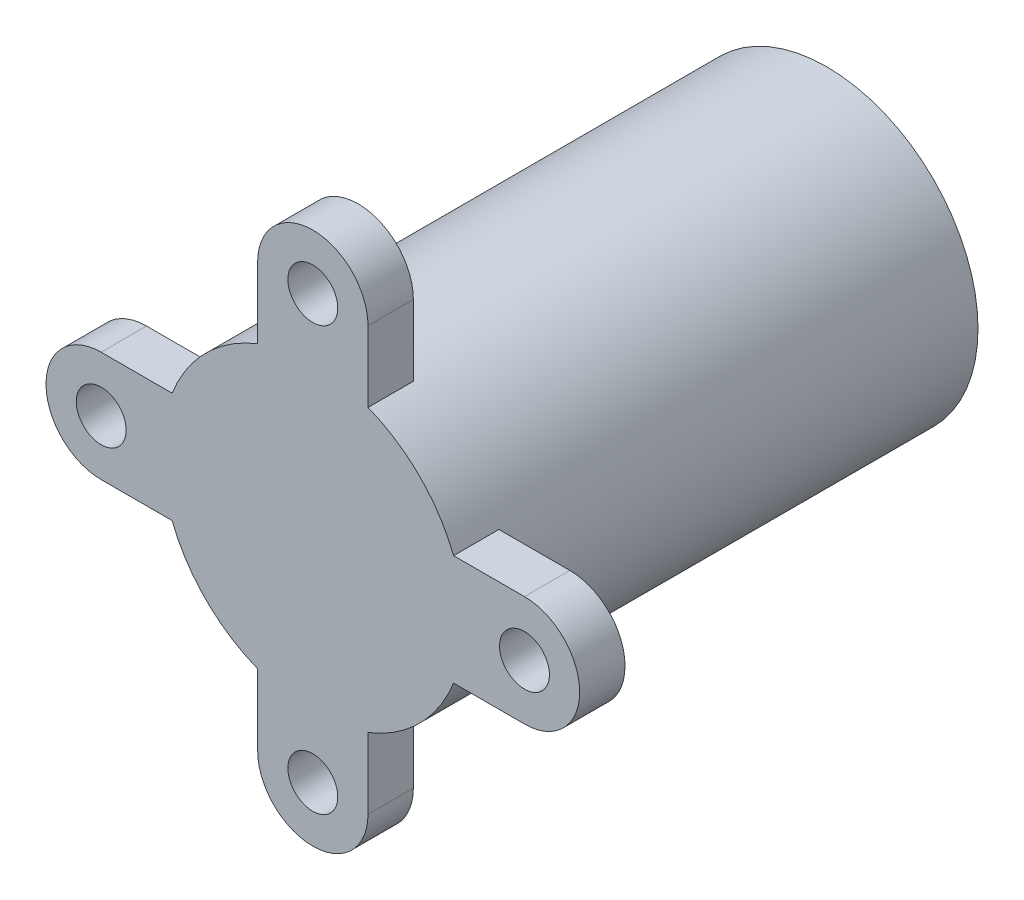
ISO-10303-21;
HEADER;
FILE_DESCRIPTION(('STEP AP214'),'2;1');
FILE_NAME('part.step','',(''),(''),'','','');
FILE_SCHEMA(('AUTOMOTIVE_DESIGN { 1 0 10303 214 1 1 1 1 }'));
ENDSEC;
DATA;
#1=APPLICATION_CONTEXT('core data for automotive mechanical design processes');
#2=APPLICATION_PROTOCOL_DEFINITION('international standard','automotive_design',2000,#1);
#3=PRODUCT_CONTEXT('',#1,'mechanical');
#4=PRODUCT('Part','Part','',(#3));
#5=PRODUCT_RELATED_PRODUCT_CATEGORY('part','',(#4));
#6=PRODUCT_DEFINITION_FORMATION('','',#4);
#7=PRODUCT_DEFINITION_CONTEXT('part definition',#1,'design');
#8=PRODUCT_DEFINITION('design','',#6,#7);
#9=PRODUCT_DEFINITION_SHAPE('','',#8);
#10=(LENGTH_UNIT() NAMED_UNIT(*) SI_UNIT(.MILLI.,.METRE.));
#11=(NAMED_UNIT(*) PLANE_ANGLE_UNIT() SI_UNIT($,.RADIAN.));
#12=(NAMED_UNIT(*) SI_UNIT($,.STERADIAN.) SOLID_ANGLE_UNIT());
#13=UNCERTAINTY_MEASURE_WITH_UNIT(LENGTH_MEASURE(1.E-05),#10,'distance_accuracy_value','');
#14=(GEOMETRIC_REPRESENTATION_CONTEXT(3) GLOBAL_UNCERTAINTY_ASSIGNED_CONTEXT((#13)) GLOBAL_UNIT_ASSIGNED_CONTEXT((#10,
#11,#12)) REPRESENTATION_CONTEXT('',''));
#15=CARTESIAN_POINT('',(0.,0.,0.));
#16=DIRECTION('',(0.,0.,1.));
#17=DIRECTION('',(1.,0.,0.));
#18=AXIS2_PLACEMENT_3D('',#15,#16,#17);
#19=CARTESIAN_POINT('',(0.,0.,0.));
#20=DIRECTION('',(0.,0.,1.));
#21=DIRECTION('',(1.,0.,0.));
#22=AXIS2_PLACEMENT_3D('',#19,#20,#21);
#23=PLANE('',#22);
#24=CARTESIAN_POINT('',(0.,0.,0.));
#25=DIRECTION('',(0.,0.,-1.));
#26=DIRECTION('',(1.,0.,0.));
#27=AXIS2_PLACEMENT_3D('',#24,#25,#26);
#28=CIRCLE('',#27,4.25);
#29=CARTESIAN_POINT('',(-4.25,0.,0.));
#30=VERTEX_POINT('',#29);
#31=EDGE_CURVE('E425',#30,#30,#28,.T.);
#32=ORIENTED_EDGE('',*,*,#31,.T.);
#33=EDGE_LOOP('',(#32));
#34=FACE_BOUND('',#33,.T.);
#35=ADVANCED_FACE('F16',(#34),#23,.F.);
#36=CARTESIAN_POINT('',(0.,0.,20.));
#37=DIRECTION('',(0.,0.,1.));
#38=DIRECTION('',(1.,0.,0.));
#39=AXIS2_PLACEMENT_3D('',#36,#37,#38);
#40=PLANE('',#39);
#41=CARTESIAN_POINT('',(14.,0.,20.));
#42=DIRECTION('',(0.,0.,-1.));
#43=DIRECTION('',(-1.,0.,0.));
#44=AXIS2_PLACEMENT_3D('',#41,#42,#43);
#45=CIRCLE('',#44,1.65);
#46=CARTESIAN_POINT('',(15.65,0.,20.));
#47=VERTEX_POINT('',#46);
#48=EDGE_CURVE('E415',#47,#47,#45,.T.);
#49=ORIENTED_EDGE('',*,*,#48,.T.);
#50=EDGE_LOOP('',(#49));
#51=FACE_BOUND('',#50,.T.);
#52=CARTESIAN_POINT('',(0.,14.,20.));
#53=DIRECTION('',(0.,0.,-1.));
#54=DIRECTION('',(0.,-1.,0.));
#55=AXIS2_PLACEMENT_3D('',#52,#53,#54);
#56=CIRCLE('',#55,1.65);
#57=CARTESIAN_POINT('',(0.,15.65,20.));
#58=VERTEX_POINT('',#57);
#59=EDGE_CURVE('E373',#58,#58,#56,.T.);
#60=ORIENTED_EDGE('',*,*,#59,.T.);
#61=EDGE_LOOP('',(#60));
#62=FACE_BOUND('',#61,.T.);
#63=CARTESIAN_POINT('',(-14.,0.,20.));
#64=DIRECTION('',(0.,0.,-1.));
#65=DIRECTION('',(1.,0.,0.));
#66=AXIS2_PLACEMENT_3D('',#63,#64,#65);
#67=CIRCLE('',#66,1.65);
#68=CARTESIAN_POINT('',(-15.65,0.,20.));
#69=VERTEX_POINT('',#68);
#70=EDGE_CURVE('E387',#69,#69,#67,.T.);
#71=ORIENTED_EDGE('',*,*,#70,.T.);
#72=EDGE_LOOP('',(#71));
#73=FACE_BOUND('',#72,.T.);
#74=CARTESIAN_POINT('',(0.,-14.,20.));
#75=DIRECTION('',(0.,0.,-1.));
#76=DIRECTION('',(0.,1.,0.));
#77=AXIS2_PLACEMENT_3D('',#74,#75,#76);
#78=CIRCLE('',#77,1.65);
#79=CARTESIAN_POINT('',(0.,-15.65,20.));
#80=VERTEX_POINT('',#79);
#81=EDGE_CURVE('E442',#80,#80,#78,.T.);
#82=ORIENTED_EDGE('',*,*,#81,.T.);
#83=EDGE_LOOP('',(#82));
#84=FACE_BOUND('',#83,.T.);
#85=CARTESIAN_POINT('',(0.,0.,20.));
#86=DIRECTION('',(0.,0.,1.));
#87=DIRECTION('',(1.,0.,0.));
#88=AXIS2_PLACEMENT_3D('',#85,#86,#87);
#89=CIRCLE('',#88,10.);
#90=CARTESIAN_POINT('',(9.31007518766632,3.65,20.));
#91=VERTEX_POINT('',#90);
#92=CARTESIAN_POINT('',(3.65,9.31007518766632,20.));
#93=VERTEX_POINT('',#92);
#94=EDGE_CURVE('E27',#91,#93,#89,.T.);
#95=ORIENTED_EDGE('',*,*,#94,.T.);
#96=DIRECTION('',(0.,-1.,0.));
#97=VECTOR('',#96,1.);
#98=CARTESIAN_POINT('',(3.65,14.,20.));
#99=LINE('',#98,#97);
#100=CARTESIAN_POINT('',(3.65,14.,20.));
#101=VERTEX_POINT('',#100);
#102=EDGE_CURVE('E488',#101,#93,#99,.T.);
#103=ORIENTED_EDGE('',*,*,#102,.F.);
#104=CARTESIAN_POINT('',(0.,14.,20.));
#105=DIRECTION('',(0.,0.,1.));
#106=DIRECTION('',(0.,1.,0.));
#107=AXIS2_PLACEMENT_3D('',#104,#105,#106);
#108=CIRCLE('',#107,3.65);
#109=CARTESIAN_POINT('',(-3.65,14.,20.));
#110=VERTEX_POINT('',#109);
#111=EDGE_CURVE('E396',#101,#110,#108,.T.);
#112=ORIENTED_EDGE('',*,*,#111,.T.);
#113=DIRECTION('',(0.,-1.,0.));
#114=VECTOR('',#113,1.);
#115=CARTESIAN_POINT('',(-3.65,14.,20.));
#116=LINE('',#115,#114);
#117=CARTESIAN_POINT('',(-3.65,9.31007518766632,20.));
#118=VERTEX_POINT('',#117);
#119=EDGE_CURVE('E350',#110,#118,#116,.T.);
#120=ORIENTED_EDGE('',*,*,#119,.T.);
#121=CARTESIAN_POINT('',(0.,0.,20.));
#122=DIRECTION('',(0.,0.,1.));
#123=DIRECTION('',(1.,0.,0.));
#124=AXIS2_PLACEMENT_3D('',#121,#122,#123);
#125=CIRCLE('',#124,10.);
#126=CARTESIAN_POINT('',(-9.31007518766632,3.65,20.));
#127=VERTEX_POINT('',#126);
#128=EDGE_CURVE('E330',#118,#127,#125,.T.);
#129=ORIENTED_EDGE('',*,*,#128,.T.);
#130=DIRECTION('',(1.,0.,0.));
#131=VECTOR('',#130,1.);
#132=CARTESIAN_POINT('',(-14.,3.65,20.));
#133=LINE('',#132,#131);
#134=CARTESIAN_POINT('',(-14.,3.65,20.));
#135=VERTEX_POINT('',#134);
#136=EDGE_CURVE('E540',#135,#127,#133,.T.);
#137=ORIENTED_EDGE('',*,*,#136,.F.);
#138=CARTESIAN_POINT('',(-14.,0.,20.));
#139=DIRECTION('',(0.,0.,1.));
#140=DIRECTION('',(-1.,0.,0.));
#141=AXIS2_PLACEMENT_3D('',#138,#139,#140);
#142=CIRCLE('',#141,3.65);
#143=CARTESIAN_POINT('',(-14.,-3.65,20.));
#144=VERTEX_POINT('',#143);
#145=EDGE_CURVE('E192',#135,#144,#142,.T.);
#146=ORIENTED_EDGE('',*,*,#145,.T.);
#147=DIRECTION('',(1.,0.,0.));
#148=VECTOR('',#147,1.);
#149=CARTESIAN_POINT('',(-14.,-3.65,20.));
#150=LINE('',#149,#148);
#151=CARTESIAN_POINT('',(-9.31007518766632,-3.65,20.));
#152=VERTEX_POINT('',#151);
#153=EDGE_CURVE('E383',#144,#152,#150,.T.);
#154=ORIENTED_EDGE('',*,*,#153,.T.);
#155=CARTESIAN_POINT('',(0.,0.,20.));
#156=DIRECTION('',(0.,0.,1.));
#157=DIRECTION('',(1.,0.,0.));
#158=AXIS2_PLACEMENT_3D('',#155,#156,#157);
#159=CIRCLE('',#158,10.);
#160=CARTESIAN_POINT('',(-3.65,-9.31007518766632,20.));
#161=VERTEX_POINT('',#160);
#162=EDGE_CURVE('E176',#152,#161,#159,.T.);
#163=ORIENTED_EDGE('',*,*,#162,.T.);
#164=DIRECTION('',(0.,1.,0.));
#165=VECTOR('',#164,1.);
#166=CARTESIAN_POINT('',(-3.65,-14.,20.));
#167=LINE('',#166,#165);
#168=CARTESIAN_POINT('',(-3.65,-14.,20.));
#169=VERTEX_POINT('',#168);
#170=EDGE_CURVE('E363',#169,#161,#167,.T.);
#171=ORIENTED_EDGE('',*,*,#170,.F.);
#172=CARTESIAN_POINT('',(0.,-14.,20.));
#173=DIRECTION('',(0.,0.,1.));
#174=DIRECTION('',(0.,-1.,0.));
#175=AXIS2_PLACEMENT_3D('',#172,#173,#174);
#176=CIRCLE('',#175,3.65);
#177=CARTESIAN_POINT('',(3.65,-14.,20.));
#178=VERTEX_POINT('',#177);
#179=EDGE_CURVE('E392',#169,#178,#176,.T.);
#180=ORIENTED_EDGE('',*,*,#179,.T.);
#181=DIRECTION('',(0.,1.,0.));
#182=VECTOR('',#181,1.);
#183=CARTESIAN_POINT('',(3.65,-14.,20.));
#184=LINE('',#183,#182);
#185=CARTESIAN_POINT('',(3.65,-9.31007518766632,20.));
#186=VERTEX_POINT('',#185);
#187=EDGE_CURVE('E431',#178,#186,#184,.T.);
#188=ORIENTED_EDGE('',*,*,#187,.T.);
#189=CARTESIAN_POINT('',(0.,0.,20.));
#190=DIRECTION('',(0.,0.,1.));
#191=DIRECTION('',(1.,0.,0.));
#192=AXIS2_PLACEMENT_3D('',#189,#190,#191);
#193=CIRCLE('',#192,10.);
#194=CARTESIAN_POINT('',(9.31007518766632,-3.65,20.));
#195=VERTEX_POINT('',#194);
#196=EDGE_CURVE('E11',#186,#195,#193,.T.);
#197=ORIENTED_EDGE('',*,*,#196,.T.);
#198=DIRECTION('',(-1.,0.,0.));
#199=VECTOR('',#198,1.);
#200=CARTESIAN_POINT('',(14.,-3.65,20.));
#201=LINE('',#200,#199);
#202=CARTESIAN_POINT('',(14.,-3.65,20.));
#203=VERTEX_POINT('',#202);
#204=EDGE_CURVE('E546',#203,#195,#201,.T.);
#205=ORIENTED_EDGE('',*,*,#204,.F.);
#206=CARTESIAN_POINT('',(14.,0.,20.));
#207=DIRECTION('',(0.,0.,1.));
#208=DIRECTION('',(1.,0.,0.));
#209=AXIS2_PLACEMENT_3D('',#206,#207,#208);
#210=CIRCLE('',#209,3.65);
#211=CARTESIAN_POINT('',(14.,3.65,20.));
#212=VERTEX_POINT('',#211);
#213=EDGE_CURVE('E569',#203,#212,#210,.T.);
#214=ORIENTED_EDGE('',*,*,#213,.T.);
#215=DIRECTION('',(-1.,0.,0.));
#216=VECTOR('',#215,1.);
#217=CARTESIAN_POINT('',(14.,3.65,20.));
#218=LINE('',#217,#216);
#219=EDGE_CURVE('E417',#212,#91,#218,.T.);
#220=ORIENTED_EDGE('',*,*,#219,.T.);
#221=EDGE_LOOP('',(#95,#103,#112,#120,#129,#137,#146,#154,#163,#171,#180,#188,#197,#205,#214,#220));
#222=FACE_BOUND('',#221,.T.);
#223=ADVANCED_FACE('F18',(#51,#62,#73,#84,#222),#40,.T.);
#224=CARTESIAN_POINT('',(0.,0.,0.));
#225=DIRECTION('',(0.,0.,1.));
#226=DIRECTION('',(1.,0.,0.));
#227=AXIS2_PLACEMENT_3D('',#224,#225,#226);
#228=CYLINDRICAL_SURFACE('',#227,10.);
#229=DIRECTION('',(0.,0.,1.));
#230=VECTOR('',#229,1.);
#231=CARTESIAN_POINT('',(-3.65,-9.31007518766632,0.));
#232=LINE('',#231,#230);
#233=CARTESIAN_POINT('',(-3.65,-9.31007518766632,17.));
#234=VERTEX_POINT('',#233);
#235=EDGE_CURVE('E367',#234,#161,#232,.T.);
#236=ORIENTED_EDGE('',*,*,#235,.T.);
#237=ORIENTED_EDGE('',*,*,#162,.F.);
#238=DIRECTION('',(0.,0.,-1.));
#239=VECTOR('',#238,1.);
#240=CARTESIAN_POINT('',(-9.31007518766632,-3.65,0.));
#241=LINE('',#240,#239);
#242=CARTESIAN_POINT('',(-9.31007518766632,-3.65,17.));
#243=VERTEX_POINT('',#242);
#244=EDGE_CURVE('E453',#152,#243,#241,.T.);
#245=ORIENTED_EDGE('',*,*,#244,.T.);
#246=CARTESIAN_POINT('',(0.,0.,17.));
#247=DIRECTION('',(0.,0.,-1.));
#248=DIRECTION('',(1.,0.,0.));
#249=AXIS2_PLACEMENT_3D('',#246,#247,#248);
#250=CIRCLE('',#249,10.);
#251=CARTESIAN_POINT('',(-10.,0.,17.));
#252=VERTEX_POINT('',#251);
#253=EDGE_CURVE('E299',#243,#252,#250,.T.);
#254=ORIENTED_EDGE('',*,*,#253,.T.);
#255=DIRECTION('',(0.,0.,-1.));
#256=VECTOR('',#255,1.);
#257=CARTESIAN_POINT('',(-10.,0.,0.));
#258=LINE('',#257,#256);
#259=CARTESIAN_POINT('',(-10.,0.,-14.));
#260=VERTEX_POINT('',#259);
#261=EDGE_CURVE('E325',#252,#260,#258,.T.);
#262=ORIENTED_EDGE('',*,*,#261,.T.);
#263=CARTESIAN_POINT('',(0.,0.,-14.));
#264=DIRECTION('',(0.,0.,-1.));
#265=DIRECTION('',(1.,0.,0.));
#266=AXIS2_PLACEMENT_3D('',#263,#264,#265);
#267=CIRCLE('',#266,10.);
#268=EDGE_CURVE('E328',#260,#260,#267,.T.);
#269=ORIENTED_EDGE('',*,*,#268,.F.);
#270=ORIENTED_EDGE('',*,*,#261,.F.);
#271=CARTESIAN_POINT('',(0.,0.,17.));
#272=DIRECTION('',(0.,0.,-1.));
#273=DIRECTION('',(1.,0.,0.));
#274=AXIS2_PLACEMENT_3D('',#271,#272,#273);
#275=CIRCLE('',#274,10.);
#276=CARTESIAN_POINT('',(-9.31007518766632,3.65,17.));
#277=VERTEX_POINT('',#276);
#278=EDGE_CURVE('E405',#252,#277,#275,.T.);
#279=ORIENTED_EDGE('',*,*,#278,.T.);
#280=DIRECTION('',(0.,0.,1.));
#281=VECTOR('',#280,1.);
#282=CARTESIAN_POINT('',(-9.31007518766632,3.65,0.));
#283=LINE('',#282,#281);
#284=EDGE_CURVE('E402',#277,#127,#283,.T.);
#285=ORIENTED_EDGE('',*,*,#284,.T.);
#286=ORIENTED_EDGE('',*,*,#128,.F.);
#287=DIRECTION('',(0.,0.,-1.));
#288=VECTOR('',#287,1.);
#289=CARTESIAN_POINT('',(-3.65,9.31007518766632,0.));
#290=LINE('',#289,#288);
#291=CARTESIAN_POINT('',(-3.65,9.31007518766632,17.));
#292=VERTEX_POINT('',#291);
#293=EDGE_CURVE('E356',#118,#292,#290,.T.);
#294=ORIENTED_EDGE('',*,*,#293,.T.);
#295=CARTESIAN_POINT('',(0.,0.,17.));
#296=DIRECTION('',(0.,0.,-1.));
#297=DIRECTION('',(1.,0.,0.));
#298=AXIS2_PLACEMENT_3D('',#295,#296,#297);
#299=CIRCLE('',#298,10.);
#300=CARTESIAN_POINT('',(3.65,9.31007518766632,17.));
#301=VERTEX_POINT('',#300);
#302=EDGE_CURVE('E358',#292,#301,#299,.T.);
#303=ORIENTED_EDGE('',*,*,#302,.T.);
#304=DIRECTION('',(0.,0.,1.));
#305=VECTOR('',#304,1.);
#306=CARTESIAN_POINT('',(3.65,9.31007518766632,0.));
#307=LINE('',#306,#305);
#308=EDGE_CURVE('E526',#301,#93,#307,.T.);
#309=ORIENTED_EDGE('',*,*,#308,.T.);
#310=ORIENTED_EDGE('',*,*,#94,.F.);
#311=DIRECTION('',(0.,0.,-1.));
#312=VECTOR('',#311,1.);
#313=CARTESIAN_POINT('',(9.31007518766632,3.65,0.));
#314=LINE('',#313,#312);
#315=CARTESIAN_POINT('',(9.31007518766632,3.65,17.));
#316=VERTEX_POINT('',#315);
#317=EDGE_CURVE('E481',#91,#316,#314,.T.);
#318=ORIENTED_EDGE('',*,*,#317,.T.);
#319=CARTESIAN_POINT('',(0.,0.,17.));
#320=DIRECTION('',(0.,0.,-1.));
#321=DIRECTION('',(1.,0.,0.));
#322=AXIS2_PLACEMENT_3D('',#319,#320,#321);
#323=CIRCLE('',#322,10.);
#324=CARTESIAN_POINT('',(9.31007518766632,-3.65,17.));
#325=VERTEX_POINT('',#324);
#326=EDGE_CURVE('E464',#316,#325,#323,.T.);
#327=ORIENTED_EDGE('',*,*,#326,.T.);
#328=DIRECTION('',(0.,0.,1.));
#329=VECTOR('',#328,1.);
#330=CARTESIAN_POINT('',(9.31007518766632,-3.65,0.));
#331=LINE('',#330,#329);
#332=EDGE_CURVE('E550',#325,#195,#331,.T.);
#333=ORIENTED_EDGE('',*,*,#332,.T.);
#334=ORIENTED_EDGE('',*,*,#196,.F.);
#335=DIRECTION('',(0.,0.,-1.));
#336=VECTOR('',#335,1.);
#337=CARTESIAN_POINT('',(3.65,-9.31007518766632,0.));
#338=LINE('',#337,#336);
#339=CARTESIAN_POINT('',(3.65,-9.31007518766632,17.));
#340=VERTEX_POINT('',#339);
#341=EDGE_CURVE('E368',#186,#340,#338,.T.);
#342=ORIENTED_EDGE('',*,*,#341,.T.);
#343=CARTESIAN_POINT('',(0.,0.,17.));
#344=DIRECTION('',(0.,0.,-1.));
#345=DIRECTION('',(1.,0.,0.));
#346=AXIS2_PLACEMENT_3D('',#343,#344,#345);
#347=CIRCLE('',#346,10.);
#348=EDGE_CURVE('E459',#340,#234,#347,.T.);
#349=ORIENTED_EDGE('',*,*,#348,.T.);
#350=EDGE_LOOP('',(#236,#237,#245,#254,#262,#269,#270,#279,#285,#286,#294,#303,#309,#310,#318,
#327,#333,#334,#342,#349));
#351=FACE_BOUND('',#350,.T.);
#352=ADVANCED_FACE('F327',(#351),#228,.T.);
#353=CARTESIAN_POINT('',(-3.9,-6.75499814951862,-8.));
#354=DIRECTION('',(0.,1.,0.));
#355=DIRECTION('',(1.,0.,0.));
#356=AXIS2_PLACEMENT_3D('',#353,#354,#355);
#357=PLANE('',#356);
#358=DIRECTION('',(1.,0.,0.));
#359=VECTOR('',#358,1.);
#360=CARTESIAN_POINT('',(-1.95,-6.75499814951862,-13.));
#361=LINE('',#360,#359);
#362=CARTESIAN_POINT('',(-3.9,-6.75499814951862,-13.));
#363=VERTEX_POINT('',#362);
#364=CARTESIAN_POINT('',(3.9,-6.75499814951862,-13.));
#365=VERTEX_POINT('',#364);
#366=EDGE_CURVE('E645',#363,#365,#361,.T.);
#367=ORIENTED_EDGE('',*,*,#366,.F.);
#368=DIRECTION('',(0.,0.,-1.));
#369=VECTOR('',#368,1.);
#370=CARTESIAN_POINT('',(-3.9,-6.75499814951862,-8.));
#371=LINE('',#370,#369);
#372=CARTESIAN_POINT('',(-3.9,-6.75499814951862,-8.));
#373=VERTEX_POINT('',#372);
#374=EDGE_CURVE('E506',#373,#363,#371,.T.);
#375=ORIENTED_EDGE('',*,*,#374,.F.);
#376=DIRECTION('',(-1.,0.,0.));
#377=VECTOR('',#376,1.);
#378=CARTESIAN_POINT('',(-1.95,-6.75499814951862,-8.));
#379=LINE('',#378,#377);
#380=CARTESIAN_POINT('',(3.9,-6.75499814951862,-8.));
#381=VERTEX_POINT('',#380);
#382=EDGE_CURVE('E514',#381,#373,#379,.T.);
#383=ORIENTED_EDGE('',*,*,#382,.F.);
#384=DIRECTION('',(0.,0.,-1.));
#385=VECTOR('',#384,1.);
#386=CARTESIAN_POINT('',(3.9,-6.75499814951862,-8.));
#387=LINE('',#386,#385);
#388=EDGE_CURVE('E261',#381,#365,#387,.T.);
#389=ORIENTED_EDGE('',*,*,#388,.T.);
#390=EDGE_LOOP('',(#367,#375,#383,#389));
#391=FACE_BOUND('',#390,.T.);
#392=ADVANCED_FACE('F947',(#391),#357,.T.);
#393=CARTESIAN_POINT('',(3.9,-6.75499814951862,-8.));
#394=DIRECTION('',(-0.866025403784439,0.5,0.));
#395=DIRECTION('',(0.,0.,1.));
#396=AXIS2_PLACEMENT_3D('',#393,#394,#395);
#397=PLANE('',#396);
#398=DIRECTION('',(0.5,0.866025403784439,0.));
#399=VECTOR('',#398,1.);
#400=CARTESIAN_POINT('',(4.875,-5.06624861213897,-13.));
#401=LINE('',#400,#399);
#402=CARTESIAN_POINT('',(7.8,0.,-13.));
#403=VERTEX_POINT('',#402);
#404=EDGE_CURVE('E501',#365,#403,#401,.T.);
#405=ORIENTED_EDGE('',*,*,#404,.F.);
#406=ORIENTED_EDGE('',*,*,#388,.F.);
#407=DIRECTION('',(-0.5,-0.866025403784439,0.));
#408=VECTOR('',#407,1.);
#409=CARTESIAN_POINT('',(4.875,-5.06624861213897,-8.));
#410=LINE('',#409,#408);
#411=CARTESIAN_POINT('',(7.8,0.,-8.));
#412=VERTEX_POINT('',#411);
#413=EDGE_CURVE('E609',#412,#381,#410,.T.);
#414=ORIENTED_EDGE('',*,*,#413,.F.);
#415=DIRECTION('',(0.,0.,-1.));
#416=VECTOR('',#415,1.);
#417=CARTESIAN_POINT('',(7.8,0.,-8.));
#418=LINE('',#417,#416);
#419=EDGE_CURVE('E467',#412,#403,#418,.T.);
#420=ORIENTED_EDGE('',*,*,#419,.T.);
#421=EDGE_LOOP('',(#405,#406,#414,#420));
#422=FACE_BOUND('',#421,.T.);
#423=ADVANCED_FACE('F941',(#422),#397,.T.);
#424=CARTESIAN_POINT('',(7.8,0.,-8.));
#425=DIRECTION('',(-0.866025403784439,-0.5,0.));
#426=DIRECTION('',(-0.5,0.866025403784439,0.));
#427=AXIS2_PLACEMENT_3D('',#424,#425,#426);
#428=PLANE('',#427);
#429=DIRECTION('',(-0.5,0.866025403784439,0.));
#430=VECTOR('',#429,1.);
#431=CARTESIAN_POINT('',(6.825,1.68874953737966,-13.));
#432=LINE('',#431,#430);
#433=CARTESIAN_POINT('',(3.9,6.75499814951862,-13.));
#434=VERTEX_POINT('',#433);
#435=EDGE_CURVE('E473',#403,#434,#432,.T.);
#436=ORIENTED_EDGE('',*,*,#435,.F.);
#437=ORIENTED_EDGE('',*,*,#419,.F.);
#438=DIRECTION('',(0.5,-0.866025403784439,0.));
#439=VECTOR('',#438,1.);
#440=CARTESIAN_POINT('',(6.825,1.68874953737966,-8.));
#441=LINE('',#440,#439);
#442=CARTESIAN_POINT('',(3.9,6.75499814951862,-8.));
#443=VERTEX_POINT('',#442);
#444=EDGE_CURVE('E319',#443,#412,#441,.T.);
#445=ORIENTED_EDGE('',*,*,#444,.F.);
#446=DIRECTION('',(0.,0.,-1.));
#447=VECTOR('',#446,1.);
#448=CARTESIAN_POINT('',(3.9,6.75499814951862,-8.));
#449=LINE('',#448,#447);
#450=EDGE_CURVE('E346',#443,#434,#449,.T.);
#451=ORIENTED_EDGE('',*,*,#450,.T.);
#452=EDGE_LOOP('',(#436,#437,#445,#451));
#453=FACE_BOUND('',#452,.T.);
#454=ADVANCED_FACE('F946',(#453),#428,.T.);
#455=CARTESIAN_POINT('',(13.4800375938332,0.,17.));
#456=DIRECTION('',(0.,0.,1.));
#457=DIRECTION('',(1.,0.,0.));
#458=AXIS2_PLACEMENT_3D('',#455,#456,#457);
#459=PLANE('',#458);
#460=CARTESIAN_POINT('',(14.,0.,17.));
#461=DIRECTION('',(0.,0.,1.));
#462=DIRECTION('',(-1.,0.,0.));
#463=AXIS2_PLACEMENT_3D('',#460,#461,#462);
#464=CIRCLE('',#463,1.65);
#465=CARTESIAN_POINT('',(15.65,0.,17.));
#466=VERTEX_POINT('',#465);
#467=EDGE_CURVE('E361',#466,#466,#464,.T.);
#468=ORIENTED_EDGE('',*,*,#467,.T.);
#469=EDGE_LOOP('',(#468));
#470=FACE_BOUND('',#469,.T.);
#471=CARTESIAN_POINT('',(14.,0.,17.));
#472=DIRECTION('',(0.,0.,-1.));
#473=DIRECTION('',(1.,0.,0.));
#474=AXIS2_PLACEMENT_3D('',#471,#472,#473);
#475=CIRCLE('',#474,3.65);
#476=CARTESIAN_POINT('',(14.,3.65,17.));
#477=VERTEX_POINT('',#476);
#478=CARTESIAN_POINT('',(14.,-3.65,17.));
#479=VERTEX_POINT('',#478);
#480=EDGE_CURVE('E41',#477,#479,#475,.T.);
#481=ORIENTED_EDGE('',*,*,#480,.T.);
#482=DIRECTION('',(-1.,0.,0.));
#483=VECTOR('',#482,1.);
#484=CARTESIAN_POINT('',(14.,-3.65,17.));
#485=LINE('',#484,#483);
#486=EDGE_CURVE('E560',#479,#325,#485,.T.);
#487=ORIENTED_EDGE('',*,*,#486,.T.);
#488=ORIENTED_EDGE('',*,*,#326,.F.);
#489=DIRECTION('',(1.,0.,0.));
#490=VECTOR('',#489,1.);
#491=CARTESIAN_POINT('',(14.,3.65,17.));
#492=LINE('',#491,#490);
#493=EDGE_CURVE('E478',#316,#477,#492,.T.);
#494=ORIENTED_EDGE('',*,*,#493,.T.);
#495=EDGE_LOOP('',(#481,#487,#488,#494));
#496=FACE_BOUND('',#495,.T.);
#497=ADVANCED_FACE('F988',(#470,#496),#459,.F.);
#498=CARTESIAN_POINT('',(14.,0.,20.));
#499=DIRECTION('',(0.,0.,-1.));
#500=DIRECTION('',(1.,0.,0.));
#501=AXIS2_PLACEMENT_3D('',#498,#499,#500);
#502=CYLINDRICAL_SURFACE('',#501,3.65);
#503=ORIENTED_EDGE('',*,*,#213,.F.);
#504=DIRECTION('',(0.,0.,-1.));
#505=VECTOR('',#504,1.);
#506=CARTESIAN_POINT('',(14.,-3.65,20.));
#507=LINE('',#506,#505);
#508=EDGE_CURVE('E566',#203,#479,#507,.T.);
#509=ORIENTED_EDGE('',*,*,#508,.T.);
#510=ORIENTED_EDGE('',*,*,#480,.F.);
#511=DIRECTION('',(0.,0.,-1.));
#512=VECTOR('',#511,1.);
#513=CARTESIAN_POINT('',(14.,3.65,20.));
#514=LINE('',#513,#512);
#515=EDGE_CURVE('E482',#212,#477,#514,.T.);
#516=ORIENTED_EDGE('',*,*,#515,.F.);
#517=EDGE_LOOP('',(#503,#509,#510,#516));
#518=FACE_BOUND('',#517,.T.);
#519=ADVANCED_FACE('F1014',(#518),#502,.T.);
#520=CARTESIAN_POINT('',(14.,-3.65,20.));
#521=DIRECTION('',(0.,-1.,0.));
#522=DIRECTION('',(-1.,0.,0.));
#523=AXIS2_PLACEMENT_3D('',#520,#521,#522);
#524=PLANE('',#523);
#525=ORIENTED_EDGE('',*,*,#204,.T.);
#526=ORIENTED_EDGE('',*,*,#332,.F.);
#527=ORIENTED_EDGE('',*,*,#486,.F.);
#528=ORIENTED_EDGE('',*,*,#508,.F.);
#529=EDGE_LOOP('',(#525,#526,#527,#528));
#530=FACE_BOUND('',#529,.T.);
#531=ADVANCED_FACE('F933',(#530),#524,.T.);
#532=CARTESIAN_POINT('',(9.31007518766632,3.65,20.));
#533=DIRECTION('',(0.,1.,0.));
#534=DIRECTION('',(1.,0.,0.));
#535=AXIS2_PLACEMENT_3D('',#532,#533,#534);
#536=PLANE('',#535);
#537=ORIENTED_EDGE('',*,*,#219,.F.);
#538=ORIENTED_EDGE('',*,*,#515,.T.);
#539=ORIENTED_EDGE('',*,*,#493,.F.);
#540=ORIENTED_EDGE('',*,*,#317,.F.);
#541=EDGE_LOOP('',(#537,#538,#539,#540));
#542=FACE_BOUND('',#541,.T.);
#543=ADVANCED_FACE('F896',(#542),#536,.T.);
#544=CARTESIAN_POINT('',(14.,0.,20.));
#545=DIRECTION('',(0.,0.,-1.));
#546=DIRECTION('',(-1.,0.,0.));
#547=AXIS2_PLACEMENT_3D('',#544,#545,#546);
#548=CYLINDRICAL_SURFACE('',#547,1.65);
#549=ORIENTED_EDGE('',*,*,#467,.F.);
#550=DIRECTION('',(0.,0.,1.));
#551=VECTOR('',#550,1.);
#552=CARTESIAN_POINT('',(15.65,0.,20.));
#553=LINE('',#552,#551);
#554=EDGE_CURVE('E414',#466,#47,#553,.T.);
#555=ORIENTED_EDGE('',*,*,#554,.T.);
#556=ORIENTED_EDGE('',*,*,#48,.F.);
#557=ORIENTED_EDGE('',*,*,#554,.F.);
#558=EDGE_LOOP('',(#549,#555,#556,#557));
#559=FACE_BOUND('',#558,.T.);
#560=ADVANCED_FACE('F734',(#559),#548,.F.);
#561=CARTESIAN_POINT('',(0.,13.4800375938332,17.));
#562=DIRECTION('',(0.,0.,1.));
#563=DIRECTION('',(1.,0.,0.));
#564=AXIS2_PLACEMENT_3D('',#561,#562,#563);
#565=PLANE('',#564);
#566=CARTESIAN_POINT('',(0.,14.,17.));
#567=DIRECTION('',(0.,0.,1.));
#568=DIRECTION('',(0.,-1.,0.));
#569=AXIS2_PLACEMENT_3D('',#566,#567,#568);
#570=CIRCLE('',#569,1.65);
#571=CARTESIAN_POINT('',(0.,15.65,17.));
#572=VERTEX_POINT('',#571);
#573=EDGE_CURVE('E374',#572,#572,#570,.T.);
#574=ORIENTED_EDGE('',*,*,#573,.T.);
#575=EDGE_LOOP('',(#574));
#576=FACE_BOUND('',#575,.T.);
#577=CARTESIAN_POINT('',(0.,14.,17.));
#578=DIRECTION('',(0.,0.,-1.));
#579=DIRECTION('',(0.,1.,0.));
#580=AXIS2_PLACEMENT_3D('',#577,#578,#579);
#581=CIRCLE('',#580,3.65);
#582=CARTESIAN_POINT('',(-3.65,14.,17.));
#583=VERTEX_POINT('',#582);
#584=CARTESIAN_POINT('',(3.65,14.,17.));
#585=VERTEX_POINT('',#584);
#586=EDGE_CURVE('E362',#583,#585,#581,.T.);
#587=ORIENTED_EDGE('',*,*,#586,.T.);
#588=DIRECTION('',(0.,-1.,0.));
#589=VECTOR('',#588,1.);
#590=CARTESIAN_POINT('',(3.65,14.,17.));
#591=LINE('',#590,#589);
#592=EDGE_CURVE('E584',#585,#301,#591,.T.);
#593=ORIENTED_EDGE('',*,*,#592,.T.);
#594=ORIENTED_EDGE('',*,*,#302,.F.);
#595=DIRECTION('',(0.,1.,0.));
#596=VECTOR('',#595,1.);
#597=CARTESIAN_POINT('',(-3.65,14.,17.));
#598=LINE('',#597,#596);
#599=EDGE_CURVE('E352',#292,#583,#598,.T.);
#600=ORIENTED_EDGE('',*,*,#599,.T.);
#601=EDGE_LOOP('',(#587,#593,#594,#600));
#602=FACE_BOUND('',#601,.T.);
#603=ADVANCED_FACE('F706',(#576,#602),#565,.F.);
#604=CARTESIAN_POINT('',(0.,14.,20.));
#605=DIRECTION('',(0.,0.,-1.));
#606=DIRECTION('',(0.,1.,0.));
#607=AXIS2_PLACEMENT_3D('',#604,#605,#606);
#608=CYLINDRICAL_SURFACE('',#607,3.65);
#609=ORIENTED_EDGE('',*,*,#111,.F.);
#610=DIRECTION('',(0.,0.,-1.));
#611=VECTOR('',#610,1.);
#612=CARTESIAN_POINT('',(3.65,14.,20.));
#613=LINE('',#612,#611);
#614=EDGE_CURVE('E580',#101,#585,#613,.T.);
#615=ORIENTED_EDGE('',*,*,#614,.T.);
#616=ORIENTED_EDGE('',*,*,#586,.F.);
#617=DIRECTION('',(0.,0.,-1.));
#618=VECTOR('',#617,1.);
#619=CARTESIAN_POINT('',(-3.65,14.,20.));
#620=LINE('',#619,#618);
#621=EDGE_CURVE('E357',#110,#583,#620,.T.);
#622=ORIENTED_EDGE('',*,*,#621,.F.);
#623=EDGE_LOOP('',(#609,#615,#616,#622));
#624=FACE_BOUND('',#623,.T.);
#625=ADVANCED_FACE('F733',(#624),#608,.T.);
#626=CARTESIAN_POINT('',(3.65,14.,20.));
#627=DIRECTION('',(1.,0.,0.));
#628=DIRECTION('',(0.,-1.,0.));
#629=AXIS2_PLACEMENT_3D('',#626,#627,#628);
#630=PLANE('',#629);
#631=ORIENTED_EDGE('',*,*,#102,.T.);
#632=ORIENTED_EDGE('',*,*,#308,.F.);
#633=ORIENTED_EDGE('',*,*,#592,.F.);
#634=ORIENTED_EDGE('',*,*,#614,.F.);
#635=EDGE_LOOP('',(#631,#632,#633,#634));
#636=FACE_BOUND('',#635,.T.);
#637=ADVANCED_FACE('F725',(#636),#630,.T.);
#638=CARTESIAN_POINT('',(-3.65,9.31007518766632,20.));
#639=DIRECTION('',(-1.,0.,0.));
#640=DIRECTION('',(0.,1.,0.));
#641=AXIS2_PLACEMENT_3D('',#638,#639,#640);
#642=PLANE('',#641);
#643=ORIENTED_EDGE('',*,*,#119,.F.);
#644=ORIENTED_EDGE('',*,*,#621,.T.);
#645=ORIENTED_EDGE('',*,*,#599,.F.);
#646=ORIENTED_EDGE('',*,*,#293,.F.);
#647=EDGE_LOOP('',(#643,#644,#645,#646));
#648=FACE_BOUND('',#647,.T.);
#649=ADVANCED_FACE('F716',(#648),#642,.T.);
#650=CARTESIAN_POINT('',(0.,14.,20.));
#651=DIRECTION('',(0.,0.,-1.));
#652=DIRECTION('',(0.,-1.,0.));
#653=AXIS2_PLACEMENT_3D('',#650,#651,#652);
#654=CYLINDRICAL_SURFACE('',#653,1.65);
#655=ORIENTED_EDGE('',*,*,#573,.F.);
#656=DIRECTION('',(0.,0.,1.));
#657=VECTOR('',#656,1.);
#658=CARTESIAN_POINT('',(0.,15.65,20.));
#659=LINE('',#658,#657);
#660=EDGE_CURVE('E369',#572,#58,#659,.T.);
#661=ORIENTED_EDGE('',*,*,#660,.T.);
#662=ORIENTED_EDGE('',*,*,#59,.F.);
#663=ORIENTED_EDGE('',*,*,#660,.F.);
#664=EDGE_LOOP('',(#655,#661,#662,#663));
#665=FACE_BOUND('',#664,.T.);
#666=ADVANCED_FACE('F713',(#665),#654,.F.);
#667=CARTESIAN_POINT('',(-13.4800375938332,0.,17.));
#668=DIRECTION('',(0.,0.,1.));
#669=DIRECTION('',(1.,0.,0.));
#670=AXIS2_PLACEMENT_3D('',#667,#668,#669);
#671=PLANE('',#670);
#672=CARTESIAN_POINT('',(-14.,0.,17.));
#673=DIRECTION('',(0.,0.,1.));
#674=DIRECTION('',(1.,0.,0.));
#675=AXIS2_PLACEMENT_3D('',#672,#673,#674);
#676=CIRCLE('',#675,1.65);
#677=CARTESIAN_POINT('',(-15.65,0.,17.));
#678=VERTEX_POINT('',#677);
#679=EDGE_CURVE('E462',#678,#678,#676,.T.);
#680=ORIENTED_EDGE('',*,*,#679,.T.);
#681=EDGE_LOOP('',(#680));
#682=FACE_BOUND('',#681,.T.);
#683=CARTESIAN_POINT('',(-14.,0.,17.));
#684=DIRECTION('',(0.,0.,-1.));
#685=DIRECTION('',(-1.,0.,0.));
#686=AXIS2_PLACEMENT_3D('',#683,#684,#685);
#687=CIRCLE('',#686,3.65);
#688=CARTESIAN_POINT('',(-14.,-3.65,17.));
#689=VERTEX_POINT('',#688);
#690=CARTESIAN_POINT('',(-14.,3.65,17.));
#691=VERTEX_POINT('',#690);
#692=EDGE_CURVE('E456',#689,#691,#687,.T.);
#693=ORIENTED_EDGE('',*,*,#692,.T.);
#694=DIRECTION('',(1.,0.,0.));
#695=VECTOR('',#694,1.);
#696=CARTESIAN_POINT('',(-14.,3.65,17.));
#697=LINE('',#696,#695);
#698=EDGE_CURVE('E397',#691,#277,#697,.T.);
#699=ORIENTED_EDGE('',*,*,#698,.T.);
#700=ORIENTED_EDGE('',*,*,#278,.F.);
#701=ORIENTED_EDGE('',*,*,#253,.F.);
#702=DIRECTION('',(-1.,0.,0.));
#703=VECTOR('',#702,1.);
#704=CARTESIAN_POINT('',(-14.,-3.65,17.));
#705=LINE('',#704,#703);
#706=EDGE_CURVE('E450',#243,#689,#705,.T.);
#707=ORIENTED_EDGE('',*,*,#706,.T.);
#708=EDGE_LOOP('',(#693,#699,#700,#701,#707));
#709=FACE_BOUND('',#708,.T.);
#710=ADVANCED_FACE('F715',(#682,#709),#671,.F.);
#711=CARTESIAN_POINT('',(-14.,0.,20.));
#712=DIRECTION('',(0.,0.,-1.));
#713=DIRECTION('',(-1.,0.,0.));
#714=AXIS2_PLACEMENT_3D('',#711,#712,#713);
#715=CYLINDRICAL_SURFACE('',#714,3.65);
#716=ORIENTED_EDGE('',*,*,#145,.F.);
#717=DIRECTION('',(0.,0.,-1.));
#718=VECTOR('',#717,1.);
#719=CARTESIAN_POINT('',(-14.,3.65,20.));
#720=LINE('',#719,#718);
#721=EDGE_CURVE('E401',#135,#691,#720,.T.);
#722=ORIENTED_EDGE('',*,*,#721,.T.);
#723=ORIENTED_EDGE('',*,*,#692,.F.);
#724=DIRECTION('',(0.,0.,-1.));
#725=VECTOR('',#724,1.);
#726=CARTESIAN_POINT('',(-14.,-3.65,20.));
#727=LINE('',#726,#725);
#728=EDGE_CURVE('E386',#144,#689,#727,.T.);
#729=ORIENTED_EDGE('',*,*,#728,.F.);
#730=EDGE_LOOP('',(#716,#722,#723,#729));
#731=FACE_BOUND('',#730,.T.);
#732=ADVANCED_FACE('F722',(#731),#715,.T.);
#733=CARTESIAN_POINT('',(-14.,3.65,20.));
#734=DIRECTION('',(0.,1.,0.));
#735=DIRECTION('',(1.,0.,0.));
#736=AXIS2_PLACEMENT_3D('',#733,#734,#735);
#737=PLANE('',#736);
#738=ORIENTED_EDGE('',*,*,#136,.T.);
#739=ORIENTED_EDGE('',*,*,#284,.F.);
#740=ORIENTED_EDGE('',*,*,#698,.F.);
#741=ORIENTED_EDGE('',*,*,#721,.F.);
#742=EDGE_LOOP('',(#738,#739,#740,#741));
#743=FACE_BOUND('',#742,.T.);
#744=ADVANCED_FACE('F909',(#743),#737,.T.);
#745=CARTESIAN_POINT('',(-9.31007518766632,-3.65,20.));
#746=DIRECTION('',(0.,-1.,0.));
#747=DIRECTION('',(0.,0.,-1.));
#748=AXIS2_PLACEMENT_3D('',#745,#746,#747);
#749=PLANE('',#748);
#750=ORIENTED_EDGE('',*,*,#153,.F.);
#751=ORIENTED_EDGE('',*,*,#728,.T.);
#752=ORIENTED_EDGE('',*,*,#706,.F.);
#753=ORIENTED_EDGE('',*,*,#244,.F.);
#754=EDGE_LOOP('',(#750,#751,#752,#753));
#755=FACE_BOUND('',#754,.T.);
#756=ADVANCED_FACE('F921',(#755),#749,.T.);
#757=CARTESIAN_POINT('',(-14.,0.,20.));
#758=DIRECTION('',(0.,0.,-1.));
#759=DIRECTION('',(1.,0.,0.));
#760=AXIS2_PLACEMENT_3D('',#757,#758,#759);
#761=CYLINDRICAL_SURFACE('',#760,1.65);
#762=ORIENTED_EDGE('',*,*,#679,.F.);
#763=DIRECTION('',(0.,0.,1.));
#764=VECTOR('',#763,1.);
#765=CARTESIAN_POINT('',(-15.65,0.,20.));
#766=LINE('',#765,#764);
#767=EDGE_CURVE('E518',#678,#69,#766,.T.);
#768=ORIENTED_EDGE('',*,*,#767,.T.);
#769=ORIENTED_EDGE('',*,*,#70,.F.);
#770=ORIENTED_EDGE('',*,*,#767,.F.);
#771=EDGE_LOOP('',(#762,#768,#769,#770));
#772=FACE_BOUND('',#771,.T.);
#773=ADVANCED_FACE('F676',(#772),#761,.F.);
#774=CARTESIAN_POINT('',(0.,-13.4800375938332,17.));
#775=DIRECTION('',(0.,0.,1.));
#776=DIRECTION('',(1.,0.,0.));
#777=AXIS2_PLACEMENT_3D('',#774,#775,#776);
#778=PLANE('',#777);
#779=CARTESIAN_POINT('',(0.,-14.,17.));
#780=DIRECTION('',(0.,0.,1.));
#781=DIRECTION('',(0.,1.,0.));
#782=AXIS2_PLACEMENT_3D('',#779,#780,#781);
#783=CIRCLE('',#782,1.65);
#784=CARTESIAN_POINT('',(0.,-15.65,17.));
#785=VERTEX_POINT('',#784);
#786=EDGE_CURVE('E511',#785,#785,#783,.T.);
#787=ORIENTED_EDGE('',*,*,#786,.T.);
#788=EDGE_LOOP('',(#787));
#789=FACE_BOUND('',#788,.T.);
#790=CARTESIAN_POINT('',(0.,-14.,17.));
#791=DIRECTION('',(0.,0.,-1.));
#792=DIRECTION('',(0.,-1.,0.));
#793=AXIS2_PLACEMENT_3D('',#790,#791,#792);
#794=CIRCLE('',#793,3.65);
#795=CARTESIAN_POINT('',(3.65,-14.,17.));
#796=VERTEX_POINT('',#795);
#797=CARTESIAN_POINT('',(-3.65,-14.,17.));
#798=VERTEX_POINT('',#797);
#799=EDGE_CURVE('E463',#796,#798,#794,.T.);
#800=ORIENTED_EDGE('',*,*,#799,.T.);
#801=DIRECTION('',(0.,1.,0.));
#802=VECTOR('',#801,1.);
#803=CARTESIAN_POINT('',(-3.65,-14.,17.));
#804=LINE('',#803,#802);
#805=EDGE_CURVE('E393',#798,#234,#804,.T.);
#806=ORIENTED_EDGE('',*,*,#805,.T.);
#807=ORIENTED_EDGE('',*,*,#348,.F.);
#808=DIRECTION('',(0.,-1.,0.));
#809=VECTOR('',#808,1.);
#810=CARTESIAN_POINT('',(3.65,-14.,17.));
#811=LINE('',#810,#809);
#812=EDGE_CURVE('E20',#340,#796,#811,.T.);
#813=ORIENTED_EDGE('',*,*,#812,.T.);
#814=EDGE_LOOP('',(#800,#806,#807,#813));
#815=FACE_BOUND('',#814,.T.);
#816=ADVANCED_FACE('F672',(#789,#815),#778,.F.);
#817=CARTESIAN_POINT('',(0.,-14.,20.));
#818=DIRECTION('',(0.,0.,-1.));
#819=DIRECTION('',(0.,-1.,0.));
#820=AXIS2_PLACEMENT_3D('',#817,#818,#819);
#821=CYLINDRICAL_SURFACE('',#820,3.65);
#822=ORIENTED_EDGE('',*,*,#179,.F.);
#823=DIRECTION('',(0.,0.,-1.));
#824=VECTOR('',#823,1.);
#825=CARTESIAN_POINT('',(-3.65,-14.,20.));
#826=LINE('',#825,#824);
#827=EDGE_CURVE('E388',#169,#798,#826,.T.);
#828=ORIENTED_EDGE('',*,*,#827,.T.);
#829=ORIENTED_EDGE('',*,*,#799,.F.);
#830=DIRECTION('',(0.,0.,-1.));
#831=VECTOR('',#830,1.);
#832=CARTESIAN_POINT('',(3.65,-14.,20.));
#833=LINE('',#832,#831);
#834=EDGE_CURVE('E428',#178,#796,#833,.T.);
#835=ORIENTED_EDGE('',*,*,#834,.F.);
#836=EDGE_LOOP('',(#822,#828,#829,#835));
#837=FACE_BOUND('',#836,.T.);
#838=ADVANCED_FACE('F675',(#837),#821,.T.);
#839=CARTESIAN_POINT('',(-3.65,-14.,20.));
#840=DIRECTION('',(-1.,0.,0.));
#841=DIRECTION('',(0.,0.,1.));
#842=AXIS2_PLACEMENT_3D('',#839,#840,#841);
#843=PLANE('',#842);
#844=ORIENTED_EDGE('',*,*,#170,.T.);
#845=ORIENTED_EDGE('',*,*,#235,.F.);
#846=ORIENTED_EDGE('',*,*,#805,.F.);
#847=ORIENTED_EDGE('',*,*,#827,.F.);
#848=EDGE_LOOP('',(#844,#845,#846,#847));
#849=FACE_BOUND('',#848,.T.);
#850=ADVANCED_FACE('F684',(#849),#843,.T.);
#851=CARTESIAN_POINT('',(3.65,-9.31007518766632,20.));
#852=DIRECTION('',(1.,0.,0.));
#853=DIRECTION('',(0.,1.,0.));
#854=AXIS2_PLACEMENT_3D('',#851,#852,#853);
#855=PLANE('',#854);
#856=ORIENTED_EDGE('',*,*,#187,.F.);
#857=ORIENTED_EDGE('',*,*,#834,.T.);
#858=ORIENTED_EDGE('',*,*,#812,.F.);
#859=ORIENTED_EDGE('',*,*,#341,.F.);
#860=EDGE_LOOP('',(#856,#857,#858,#859));
#861=FACE_BOUND('',#860,.T.);
#862=ADVANCED_FACE('F686',(#861),#855,.T.);
#863=CARTESIAN_POINT('',(0.,-14.,20.));
#864=DIRECTION('',(0.,0.,-1.));
#865=DIRECTION('',(0.,1.,0.));
#866=AXIS2_PLACEMENT_3D('',#863,#864,#865);
#867=CYLINDRICAL_SURFACE('',#866,1.65);
#868=ORIENTED_EDGE('',*,*,#786,.F.);
#869=DIRECTION('',(0.,0.,1.));
#870=VECTOR('',#869,1.);
#871=CARTESIAN_POINT('',(0.,-15.65,20.));
#872=LINE('',#871,#870);
#873=EDGE_CURVE('E248',#785,#80,#872,.T.);
#874=ORIENTED_EDGE('',*,*,#873,.T.);
#875=ORIENTED_EDGE('',*,*,#81,.F.);
#876=ORIENTED_EDGE('',*,*,#873,.F.);
#877=EDGE_LOOP('',(#868,#874,#875,#876));
#878=FACE_BOUND('',#877,.T.);
#879=ADVANCED_FACE('F670',(#878),#867,.F.);
#880=CARTESIAN_POINT('',(0.,0.,-8.));
#881=DIRECTION('',(0.,0.,1.));
#882=DIRECTION('',(1.,0.,0.));
#883=AXIS2_PLACEMENT_3D('',#880,#881,#882);
#884=PLANE('',#883);
#885=CARTESIAN_POINT('',(0.,0.,-8.));
#886=DIRECTION('',(0.,0.,-1.));
#887=DIRECTION('',(1.,0.,0.));
#888=AXIS2_PLACEMENT_3D('',#885,#886,#887);
#889=CIRCLE('',#888,5.25);
#890=CARTESIAN_POINT('',(-5.25,0.,-8.));
#891=VERTEX_POINT('',#890);
#892=EDGE_CURVE('E335',#891,#891,#889,.T.);
#893=ORIENTED_EDGE('',*,*,#892,.F.);
#894=EDGE_LOOP('',(#893));
#895=FACE_BOUND('',#894,.T.);
#896=DIRECTION('',(-0.5,0.866025403784439,0.));
#897=VECTOR('',#896,1.);
#898=CARTESIAN_POINT('',(-6.825,-1.68874953737965,-8.));
#899=LINE('',#898,#897);
#900=CARTESIAN_POINT('',(-7.8,0.,-8.));
#901=VERTEX_POINT('',#900);
#902=EDGE_CURVE('E502',#373,#901,#899,.T.);
#903=ORIENTED_EDGE('',*,*,#902,.T.);
#904=DIRECTION('',(0.5,0.866025403784439,0.));
#905=VECTOR('',#904,1.);
#906=CARTESIAN_POINT('',(-4.875,5.06624861213897,-8.));
#907=LINE('',#906,#905);
#908=CARTESIAN_POINT('',(-3.9,6.75499814951862,-8.));
#909=VERTEX_POINT('',#908);
#910=EDGE_CURVE('E489',#901,#909,#907,.T.);
#911=ORIENTED_EDGE('',*,*,#910,.T.);
#912=DIRECTION('',(1.,0.,0.));
#913=VECTOR('',#912,1.);
#914=CARTESIAN_POINT('',(1.95,6.75499814951862,-8.));
#915=LINE('',#914,#913);
#916=EDGE_CURVE('E336',#909,#443,#915,.T.);
#917=ORIENTED_EDGE('',*,*,#916,.T.);
#918=ORIENTED_EDGE('',*,*,#444,.T.);
#919=ORIENTED_EDGE('',*,*,#413,.T.);
#920=ORIENTED_EDGE('',*,*,#382,.T.);
#921=EDGE_LOOP('',(#903,#911,#917,#918,#919,#920));
#922=FACE_BOUND('',#921,.T.);
#923=ADVANCED_FACE('F694',(#895,#922),#884,.F.);
#924=CARTESIAN_POINT('',(0.,0.,0.));
#925=DIRECTION('',(0.,0.,-1.));
#926=DIRECTION('',(1.,0.,0.));
#927=AXIS2_PLACEMENT_3D('',#924,#925,#926);
#928=CYLINDRICAL_SURFACE('',#927,4.25);
#929=CARTESIAN_POINT('',(0.,0.,-7.));
#930=DIRECTION('',(0.,0.,1.));
#931=DIRECTION('',(1.,0.,0.));
#932=AXIS2_PLACEMENT_3D('',#929,#930,#931);
#933=CIRCLE('',#932,4.25);
#934=CARTESIAN_POINT('',(-4.25,0.,-7.));
#935=VERTEX_POINT('',#934);
#936=EDGE_CURVE('E519',#935,#935,#933,.T.);
#937=ORIENTED_EDGE('',*,*,#936,.F.);
#938=DIRECTION('',(0.,0.,1.));
#939=VECTOR('',#938,1.);
#940=CARTESIAN_POINT('',(-4.25,0.,0.));
#941=LINE('',#940,#939);
#942=EDGE_CURVE('E427',#935,#30,#941,.T.);
#943=ORIENTED_EDGE('',*,*,#942,.T.);
#944=ORIENTED_EDGE('',*,*,#31,.F.);
#945=ORIENTED_EDGE('',*,*,#942,.F.);
#946=EDGE_LOOP('',(#937,#943,#944,#945));
#947=FACE_BOUND('',#946,.T.);
#948=ADVANCED_FACE('F710',(#947),#928,.F.);
#949=CARTESIAN_POINT('',(0.,0.,-7.5));
#950=DIRECTION('',(0.,0.,-1.));
#951=DIRECTION('',(1.,0.,0.));
#952=AXIS2_PLACEMENT_3D('',#949,#950,#951);
#953=CONICAL_SURFACE('',#952,4.75,0.785398163397448);
#954=ORIENTED_EDGE('',*,*,#892,.T.);
#955=DIRECTION('',(0.707106781186548,0.,0.707106781186548));
#956=VECTOR('',#955,1.);
#957=CARTESIAN_POINT('',(-4.75,0.,-7.5));
#958=LINE('',#957,#956);
#959=EDGE_CURVE('E344',#891,#935,#958,.T.);
#960=ORIENTED_EDGE('',*,*,#959,.T.);
#961=ORIENTED_EDGE('',*,*,#936,.T.);
#962=ORIENTED_EDGE('',*,*,#959,.F.);
#963=EDGE_LOOP('',(#954,#960,#961,#962));
#964=FACE_BOUND('',#963,.T.);
#965=ADVANCED_FACE('F708',(#964),#953,.F.);
#966=CARTESIAN_POINT('',(0.,0.,-14.));
#967=DIRECTION('',(0.,0.,-1.));
#968=DIRECTION('',(0.,-1.,0.));
#969=AXIS2_PLACEMENT_3D('',#966,#967,#968);
#970=PLANE('',#969);
#971=DIRECTION('',(1.,0.,0.));
#972=VECTOR('',#971,1.);
#973=CARTESIAN_POINT('',(1.95,7.75499814951862,-14.));
#974=LINE('',#973,#972);
#975=CARTESIAN_POINT('',(-4.47735026918963,7.75499814951862,-14.));
#976=VERTEX_POINT('',#975);
#977=CARTESIAN_POINT('',(4.47735026918963,7.75499814951862,-14.));
#978=VERTEX_POINT('',#977);
#979=EDGE_CURVE('E507',#976,#978,#974,.T.);
#980=ORIENTED_EDGE('',*,*,#979,.F.);
#981=DIRECTION('',(0.5,0.866025403784439,0.));
#982=VECTOR('',#981,1.);
#983=CARTESIAN_POINT('',(-5.74102540378444,5.56624861213897,-14.));
#984=LINE('',#983,#982);
#985=CARTESIAN_POINT('',(-8.95470053837925,0.,-14.));
#986=VERTEX_POINT('',#985);
#987=EDGE_CURVE('E406',#986,#976,#984,.T.);
#988=ORIENTED_EDGE('',*,*,#987,.F.);
#989=DIRECTION('',(-0.5,0.866025403784439,0.));
#990=VECTOR('',#989,1.);
#991=CARTESIAN_POINT('',(-7.69102540378444,-2.18874953737965,-14.));
#992=LINE('',#991,#990);
#993=CARTESIAN_POINT('',(-4.47735026918963,-7.75499814951862,-14.));
#994=VERTEX_POINT('',#993);
#995=EDGE_CURVE('E375',#994,#986,#992,.T.);
#996=ORIENTED_EDGE('',*,*,#995,.F.);
#997=DIRECTION('',(-1.,0.,0.));
#998=VECTOR('',#997,1.);
#999=CARTESIAN_POINT('',(-1.95,-7.75499814951862,-14.));
#1000=LINE('',#999,#998);
#1001=CARTESIAN_POINT('',(4.47735026918962,-7.75499814951862,-14.));
#1002=VERTEX_POINT('',#1001);
#1003=EDGE_CURVE('E496',#1002,#994,#1000,.T.);
#1004=ORIENTED_EDGE('',*,*,#1003,.F.);
#1005=DIRECTION('',(-0.5,-0.866025403784439,0.));
#1006=VECTOR('',#1005,1.);
#1007=CARTESIAN_POINT('',(5.74102540378443,-5.56624861213897,-14.));
#1008=LINE('',#1007,#1006);
#1009=CARTESIAN_POINT('',(8.95470053837925,0.,-14.));
#1010=VERTEX_POINT('',#1009);
#1011=EDGE_CURVE('E468',#1010,#1002,#1008,.T.);
#1012=ORIENTED_EDGE('',*,*,#1011,.F.);
#1013=DIRECTION('',(0.5,-0.866025403784439,0.));
#1014=VECTOR('',#1013,1.);
#1015=CARTESIAN_POINT('',(7.69102540378444,2.18874953737966,-14.));
#1016=LINE('',#1015,#1014);
#1017=EDGE_CURVE('E579',#978,#1010,#1016,.T.);
#1018=ORIENTED_EDGE('',*,*,#1017,.F.);
#1019=EDGE_LOOP('',(#980,#988,#996,#1004,#1012,#1018));
#1020=FACE_BOUND('',#1019,.T.);
#1021=ORIENTED_EDGE('',*,*,#268,.T.);
#1022=EDGE_LOOP('',(#1021));
#1023=FACE_BOUND('',#1022,.T.);
#1024=ADVANCED_FACE('F333',(#1020,#1023),#970,.T.);
#1025=CARTESIAN_POINT('',(3.9,6.75499814951862,-8.));
#1026=DIRECTION('',(0.,-1.,0.));
#1027=DIRECTION('',(0.,0.,-1.));
#1028=AXIS2_PLACEMENT_3D('',#1025,#1026,#1027);
#1029=PLANE('',#1028);
#1030=DIRECTION('',(-1.,0.,0.));
#1031=VECTOR('',#1030,1.);
#1032=CARTESIAN_POINT('',(1.95,6.75499814951862,-13.));
#1033=LINE('',#1032,#1031);
#1034=CARTESIAN_POINT('',(-3.9,6.75499814951862,-13.));
#1035=VERTEX_POINT('',#1034);
#1036=EDGE_CURVE('E419',#434,#1035,#1033,.T.);
#1037=ORIENTED_EDGE('',*,*,#1036,.F.);
#1038=ORIENTED_EDGE('',*,*,#450,.F.);
#1039=ORIENTED_EDGE('',*,*,#916,.F.);
#1040=DIRECTION('',(0.,0.,-1.));
#1041=VECTOR('',#1040,1.);
#1042=CARTESIAN_POINT('',(-3.9,6.75499814951862,-8.));
#1043=LINE('',#1042,#1041);
#1044=EDGE_CURVE('E493',#909,#1035,#1043,.T.);
#1045=ORIENTED_EDGE('',*,*,#1044,.T.);
#1046=EDGE_LOOP('',(#1037,#1038,#1039,#1045));
#1047=FACE_BOUND('',#1046,.T.);
#1048=ADVANCED_FACE('F1034',(#1047),#1029,.T.);
#1049=CARTESIAN_POINT('',(-3.9,6.75499814951862,-8.));
#1050=DIRECTION('',(0.866025403784439,-0.5,0.));
#1051=DIRECTION('',(0.,0.,-1.));
#1052=AXIS2_PLACEMENT_3D('',#1049,#1050,#1051);
#1053=PLANE('',#1052);
#1054=DIRECTION('',(-0.5,-0.866025403784439,0.));
#1055=VECTOR('',#1054,1.);
#1056=CARTESIAN_POINT('',(-4.875,5.06624861213897,-13.));
#1057=LINE('',#1056,#1055);
#1058=CARTESIAN_POINT('',(-7.8,0.,-13.));
#1059=VERTEX_POINT('',#1058);
#1060=EDGE_CURVE('E410',#1035,#1059,#1057,.T.);
#1061=ORIENTED_EDGE('',*,*,#1060,.F.);
#1062=ORIENTED_EDGE('',*,*,#1044,.F.);
#1063=ORIENTED_EDGE('',*,*,#910,.F.);
#1064=DIRECTION('',(0.,0.,-1.));
#1065=VECTOR('',#1064,1.);
#1066=CARTESIAN_POINT('',(-7.8,0.,-8.));
#1067=LINE('',#1066,#1065);
#1068=EDGE_CURVE('E409',#901,#1059,#1067,.T.);
#1069=ORIENTED_EDGE('',*,*,#1068,.T.);
#1070=EDGE_LOOP('',(#1061,#1062,#1063,#1069));
#1071=FACE_BOUND('',#1070,.T.);
#1072=ADVANCED_FACE('F1039',(#1071),#1053,.T.);
#1073=CARTESIAN_POINT('',(-7.8,0.,-8.));
#1074=DIRECTION('',(0.866025403784439,0.5,0.));
#1075=DIRECTION('',(0.,0.,-1.));
#1076=AXIS2_PLACEMENT_3D('',#1073,#1074,#1075);
#1077=PLANE('',#1076);
#1078=DIRECTION('',(0.5,-0.866025403784439,0.));
#1079=VECTOR('',#1078,1.);
#1080=CARTESIAN_POINT('',(-6.825,-1.68874953737965,-13.));
#1081=LINE('',#1080,#1079);
#1082=EDGE_CURVE('E380',#1059,#363,#1081,.T.);
#1083=ORIENTED_EDGE('',*,*,#1082,.F.);
#1084=ORIENTED_EDGE('',*,*,#1068,.F.);
#1085=ORIENTED_EDGE('',*,*,#902,.F.);
#1086=ORIENTED_EDGE('',*,*,#374,.T.);
#1087=EDGE_LOOP('',(#1083,#1084,#1085,#1086));
#1088=FACE_BOUND('',#1087,.T.);
#1089=ADVANCED_FACE('F1091',(#1088),#1077,.T.);
#1090=CARTESIAN_POINT('',(-5.30801270189222,5.31624861213897,-13.5));
#1091=DIRECTION('',(0.612372435695795,-0.353553390593274,-0.707106781186547));
#1092=DIRECTION('',(0.,-0.894427190999916,0.447213595499959));
#1093=AXIS2_PLACEMENT_3D('',#1090,#1091,#1092);
#1094=PLANE('',#1093);
#1095=ORIENTED_EDGE('',*,*,#1060,.T.);
#1096=DIRECTION('',(0.755928946018454,0.,0.654653670707977));
#1097=VECTOR('',#1096,1.);
#1098=CARTESIAN_POINT('',(-8.95470053837925,0.,-14.));
#1099=LINE('',#1098,#1097);
#1100=EDGE_CURVE('E379',#986,#1059,#1099,.T.);
#1101=ORIENTED_EDGE('',*,*,#1100,.F.);
#1102=ORIENTED_EDGE('',*,*,#987,.T.);
#1103=DIRECTION('',(0.377964473009228,-0.654653670707976,0.654653670707977));
#1104=VECTOR('',#1103,1.);
#1105=CARTESIAN_POINT('',(-4.47735026918963,7.75499814951862,-14.));
#1106=LINE('',#1105,#1104);
#1107=EDGE_CURVE('E423',#976,#1035,#1106,.T.);
#1108=ORIENTED_EDGE('',*,*,#1107,.T.);
#1109=EDGE_LOOP('',(#1095,#1101,#1102,#1108));
#1110=FACE_BOUND('',#1109,.T.);
#1111=ADVANCED_FACE('F1096',(#1110),#1094,.T.);
#1112=CARTESIAN_POINT('',(-7.25801270189222,-1.93874953737965,-13.5));
#1113=DIRECTION('',(0.612372435695795,0.353553390593274,-0.707106781186547));
#1114=DIRECTION('',(0.,-0.894427190999916,-0.447213595499959));
#1115=AXIS2_PLACEMENT_3D('',#1112,#1113,#1114);
#1116=PLANE('',#1115);
#1117=ORIENTED_EDGE('',*,*,#1082,.T.);
#1118=DIRECTION('',(0.377964473009226,0.654653670707977,0.654653670707978));
#1119=VECTOR('',#1118,1.);
#1120=CARTESIAN_POINT('',(-4.47735026918963,-7.75499814951862,-14.));
#1121=LINE('',#1120,#1119);
#1122=EDGE_CURVE('E500',#994,#363,#1121,.T.);
#1123=ORIENTED_EDGE('',*,*,#1122,.F.);
#1124=ORIENTED_EDGE('',*,*,#995,.T.);
#1125=ORIENTED_EDGE('',*,*,#1100,.T.);
#1126=EDGE_LOOP('',(#1117,#1123,#1124,#1125));
#1127=FACE_BOUND('',#1126,.T.);
#1128=ADVANCED_FACE('F1131',(#1127),#1116,.T.);
#1129=CARTESIAN_POINT('',(-1.95,-7.25499814951862,-13.5));
#1130=DIRECTION('',(0.,0.707106781186548,-0.707106781186547));
#1131=DIRECTION('',(-1.,0.,0.));
#1132=AXIS2_PLACEMENT_3D('',#1129,#1130,#1131);
#1133=PLANE('',#1132);
#1134=ORIENTED_EDGE('',*,*,#1003,.T.);
#1135=ORIENTED_EDGE('',*,*,#1122,.T.);
#1136=ORIENTED_EDGE('',*,*,#366,.T.);
#1137=DIRECTION('',(-0.377964473009227,0.654653670707977,0.654653670707978));
#1138=VECTOR('',#1137,1.);
#1139=CARTESIAN_POINT('',(4.47735026918962,-7.75499814951862,-14.));
#1140=LINE('',#1139,#1138);
#1141=EDGE_CURVE('E472',#1002,#365,#1140,.T.);
#1142=ORIENTED_EDGE('',*,*,#1141,.F.);
#1143=EDGE_LOOP('',(#1134,#1135,#1136,#1142));
#1144=FACE_BOUND('',#1143,.T.);
#1145=ADVANCED_FACE('F884',(#1144),#1133,.T.);
#1146=CARTESIAN_POINT('',(5.30801270189221,-5.31624861213897,-13.5));
#1147=DIRECTION('',(-0.612372435695795,0.353553390593274,-0.707106781186547));
#1148=DIRECTION('',(-0.755928946018454,0.,0.654653670707978));
#1149=AXIS2_PLACEMENT_3D('',#1146,#1147,#1148);
#1150=PLANE('',#1149);
#1151=ORIENTED_EDGE('',*,*,#1011,.T.);
#1152=ORIENTED_EDGE('',*,*,#1141,.T.);
#1153=ORIENTED_EDGE('',*,*,#404,.T.);
#1154=DIRECTION('',(-0.755928946018454,0.,0.654653670707977));
#1155=VECTOR('',#1154,1.);
#1156=CARTESIAN_POINT('',(8.95470053837925,0.,-14.));
#1157=LINE('',#1156,#1155);
#1158=EDGE_CURVE('E477',#1010,#403,#1157,.T.);
#1159=ORIENTED_EDGE('',*,*,#1158,.F.);
#1160=EDGE_LOOP('',(#1151,#1152,#1153,#1159));
#1161=FACE_BOUND('',#1160,.T.);
#1162=ADVANCED_FACE('F878',(#1161),#1150,.T.);
#1163=CARTESIAN_POINT('',(7.25801270189222,1.93874953737966,-13.5));
#1164=DIRECTION('',(-0.612372435695794,-0.353553390593274,-0.707106781186548));
#1165=DIRECTION('',(-0.755928946018455,0.,0.654653670707977));
#1166=AXIS2_PLACEMENT_3D('',#1163,#1164,#1165);
#1167=PLANE('',#1166);
#1168=ORIENTED_EDGE('',*,*,#1017,.T.);
#1169=ORIENTED_EDGE('',*,*,#1158,.T.);
#1170=ORIENTED_EDGE('',*,*,#435,.T.);
#1171=DIRECTION('',(-0.377964473009228,-0.654653670707977,0.654653670707977));
#1172=VECTOR('',#1171,1.);
#1173=CARTESIAN_POINT('',(4.47735026918963,7.75499814951862,-14.));
#1174=LINE('',#1173,#1172);
#1175=EDGE_CURVE('E424',#978,#434,#1174,.T.);
#1176=ORIENTED_EDGE('',*,*,#1175,.F.);
#1177=EDGE_LOOP('',(#1168,#1169,#1170,#1176));
#1178=FACE_BOUND('',#1177,.T.);
#1179=ADVANCED_FACE('F883',(#1178),#1167,.T.);
#1180=CARTESIAN_POINT('',(1.95,7.25499814951862,-13.5));
#1181=DIRECTION('',(0.,-0.707106781186548,-0.707106781186547));
#1182=DIRECTION('',(0.,0.707106781186547,-0.707106781186548));
#1183=AXIS2_PLACEMENT_3D('',#1180,#1181,#1182);
#1184=PLANE('',#1183);
#1185=ORIENTED_EDGE('',*,*,#979,.T.);
#1186=ORIENTED_EDGE('',*,*,#1175,.T.);
#1187=ORIENTED_EDGE('',*,*,#1036,.T.);
#1188=ORIENTED_EDGE('',*,*,#1107,.F.);
#1189=EDGE_LOOP('',(#1185,#1186,#1187,#1188));
#1190=FACE_BOUND('',#1189,.T.);
#1191=ADVANCED_FACE('F964',(#1190),#1184,.T.);
#1192=CLOSED_SHELL('',(#35,#223,#352,#392,#423,#454,#497,#519,#531,#543,#560,#603,#625,#637,
#649,#666,#710,#732,#744,#756,#773,#816,#838,#850,#862,#879,#923,#948,#965,#1024,#1048,#1072,
#1089,#1111,#1128,#1145,#1162,#1179,#1191));
#1193=MANIFOLD_SOLID_BREP('B1',#1192);
#1194=ADVANCED_BREP_SHAPE_REPRESENTATION('',(#18,#1193),#14);
#1195=SHAPE_DEFINITION_REPRESENTATION(#9,#1194);
ENDSEC;
END-ISO-10303-21;
